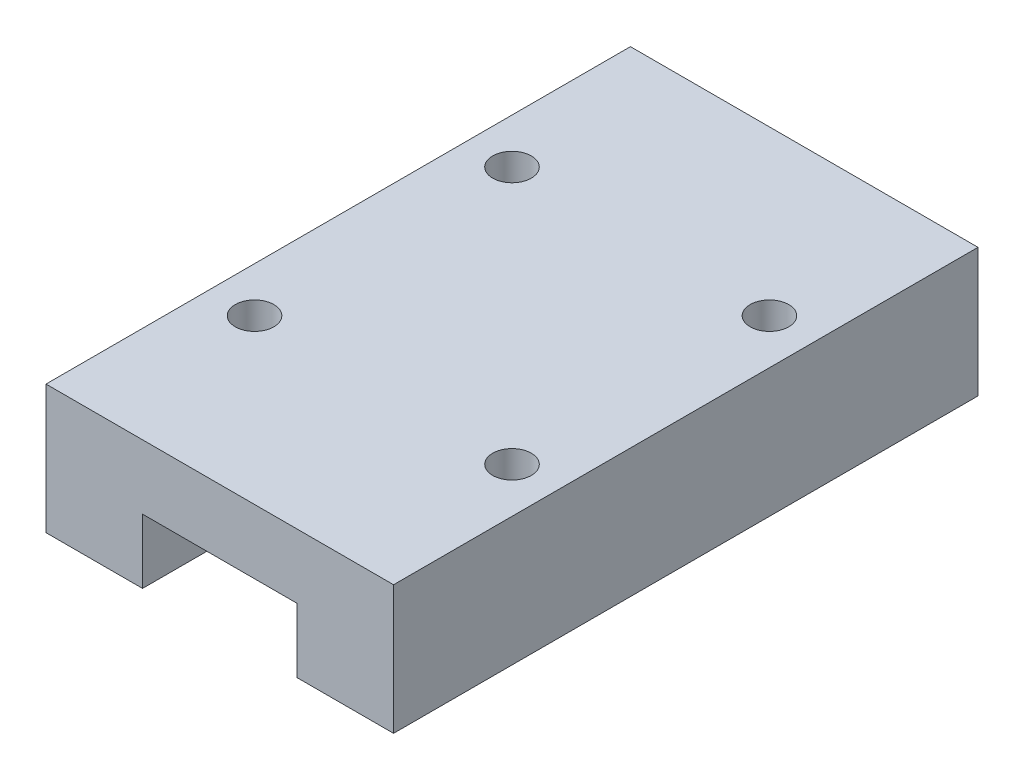
ISO-10303-21;
HEADER;
FILE_DESCRIPTION(('STEP AP214'),'2;1');
FILE_NAME('part.step','',(''),(''),'','','');
FILE_SCHEMA(('AUTOMOTIVE_DESIGN { 1 0 10303 214 1 1 1 1 }'));
ENDSEC;
DATA;
#1=APPLICATION_CONTEXT('core data for automotive mechanical design processes');
#2=APPLICATION_PROTOCOL_DEFINITION('international standard','automotive_design',2000,#1);
#3=PRODUCT_CONTEXT('',#1,'mechanical');
#4=PRODUCT('Part','Part','',(#3));
#5=PRODUCT_RELATED_PRODUCT_CATEGORY('part','',(#4));
#6=PRODUCT_DEFINITION_FORMATION('','',#4);
#7=PRODUCT_DEFINITION_CONTEXT('part definition',#1,'design');
#8=PRODUCT_DEFINITION('design','',#6,#7);
#9=PRODUCT_DEFINITION_SHAPE('','',#8);
#10=(LENGTH_UNIT() NAMED_UNIT(*) SI_UNIT(.MILLI.,.METRE.));
#11=(NAMED_UNIT(*) PLANE_ANGLE_UNIT() SI_UNIT($,.RADIAN.));
#12=(NAMED_UNIT(*) SI_UNIT($,.STERADIAN.) SOLID_ANGLE_UNIT());
#13=UNCERTAINTY_MEASURE_WITH_UNIT(LENGTH_MEASURE(1.E-05),#10,'distance_accuracy_value','');
#14=(GEOMETRIC_REPRESENTATION_CONTEXT(3) GLOBAL_UNCERTAINTY_ASSIGNED_CONTEXT((#13)) GLOBAL_UNIT_ASSIGNED_CONTEXT((#10,
#11,#12)) REPRESENTATION_CONTEXT('',''));
#15=CARTESIAN_POINT('',(0.,0.,0.));
#16=DIRECTION('',(0.,0.,1.));
#17=DIRECTION('',(1.,0.,0.));
#18=AXIS2_PLACEMENT_3D('',#15,#16,#17);
#19=CARTESIAN_POINT('',(0.,0.,45.4));
#20=DIRECTION('',(0.,1.,0.));
#21=DIRECTION('',(0.,0.,1.));
#22=AXIS2_PLACEMENT_3D('',#19,#20,#21);
#23=PLANE('',#22);
#24=DIRECTION('',(1.,0.,0.));
#25=VECTOR('',#24,1.);
#26=CARTESIAN_POINT('',(0.,0.,0.));
#27=LINE('',#26,#25);
#28=CARTESIAN_POINT('',(-6.,0.,0.));
#29=VERTEX_POINT('',#28);
#30=CARTESIAN_POINT('',(6.,0.,0.));
#31=VERTEX_POINT('',#30);
#32=EDGE_CURVE('E152',#29,#31,#27,.T.);
#33=ORIENTED_EDGE('',*,*,#32,.T.);
#34=DIRECTION('',(0.,0.,-1.));
#35=VECTOR('',#34,1.);
#36=CARTESIAN_POINT('',(6.,0.,45.4));
#37=LINE('',#36,#35);
#38=CARTESIAN_POINT('',(6.,0.,45.4));
#39=VERTEX_POINT('',#38);
#40=EDGE_CURVE('E11',#39,#31,#37,.T.);
#41=ORIENTED_EDGE('',*,*,#40,.F.);
#42=DIRECTION('',(1.,0.,0.));
#43=VECTOR('',#42,1.);
#44=CARTESIAN_POINT('',(0.,0.,45.4));
#45=LINE('',#44,#43);
#46=CARTESIAN_POINT('',(-6.,0.,45.4));
#47=VERTEX_POINT('',#46);
#48=EDGE_CURVE('E141',#47,#39,#45,.T.);
#49=ORIENTED_EDGE('',*,*,#48,.F.);
#50=DIRECTION('',(0.,0.,-1.));
#51=VECTOR('',#50,1.);
#52=CARTESIAN_POINT('',(-6.,0.,45.4));
#53=LINE('',#52,#51);
#54=EDGE_CURVE('E56',#47,#29,#53,.T.);
#55=ORIENTED_EDGE('',*,*,#54,.T.);
#56=EDGE_LOOP('',(#33,#41,#49,#55));
#57=FACE_BOUND('',#56,.T.);
#58=ADVANCED_FACE('F40',(#57),#23,.F.);
#59=CARTESIAN_POINT('',(6.,0.,45.4));
#60=DIRECTION('',(1.,0.,0.));
#61=DIRECTION('',(0.,1.,0.));
#62=AXIS2_PLACEMENT_3D('',#59,#60,#61);
#63=PLANE('',#62);
#64=DIRECTION('',(0.,-1.,0.));
#65=VECTOR('',#64,1.);
#66=CARTESIAN_POINT('',(6.,0.,0.));
#67=LINE('',#66,#65);
#68=CARTESIAN_POINT('',(6.,-5.,0.));
#69=VERTEX_POINT('',#68);
#70=EDGE_CURVE('E209',#31,#69,#67,.T.);
#71=ORIENTED_EDGE('',*,*,#70,.T.);
#72=DIRECTION('',(0.,0.,-1.));
#73=VECTOR('',#72,1.);
#74=CARTESIAN_POINT('',(6.,-5.,45.4));
#75=LINE('',#74,#73);
#76=CARTESIAN_POINT('',(6.,-5.,45.4));
#77=VERTEX_POINT('',#76);
#78=EDGE_CURVE('E48',#77,#69,#75,.T.);
#79=ORIENTED_EDGE('',*,*,#78,.F.);
#80=DIRECTION('',(0.,-1.,0.));
#81=VECTOR('',#80,1.);
#82=CARTESIAN_POINT('',(6.,0.,45.4));
#83=LINE('',#82,#81);
#84=EDGE_CURVE('E94',#39,#77,#83,.T.);
#85=ORIENTED_EDGE('',*,*,#84,.F.);
#86=ORIENTED_EDGE('',*,*,#40,.T.);
#87=EDGE_LOOP('',(#71,#79,#85,#86));
#88=FACE_BOUND('',#87,.T.);
#89=ADVANCED_FACE('F210',(#88),#63,.F.);
#90=CARTESIAN_POINT('',(0.,-5.,45.4));
#91=DIRECTION('',(0.,-1.,0.));
#92=DIRECTION('',(1.,0.,0.));
#93=AXIS2_PLACEMENT_3D('',#90,#91,#92);
#94=PLANE('',#93);
#95=DIRECTION('',(-1.,0.,0.));
#96=VECTOR('',#95,1.);
#97=CARTESIAN_POINT('',(0.,-5.,0.));
#98=LINE('',#97,#96);
#99=CARTESIAN_POINT('',(13.5,-5.,0.));
#100=VERTEX_POINT('',#99);
#101=EDGE_CURVE('E196',#100,#69,#98,.T.);
#102=ORIENTED_EDGE('',*,*,#101,.F.);
#103=DIRECTION('',(0.,0.,-1.));
#104=VECTOR('',#103,1.);
#105=CARTESIAN_POINT('',(13.5,-5.,45.4));
#106=LINE('',#105,#104);
#107=CARTESIAN_POINT('',(13.5,-5.,45.4));
#108=VERTEX_POINT('',#107);
#109=EDGE_CURVE('E204',#108,#100,#106,.T.);
#110=ORIENTED_EDGE('',*,*,#109,.F.);
#111=DIRECTION('',(-1.,0.,0.));
#112=VECTOR('',#111,1.);
#113=CARTESIAN_POINT('',(0.,-5.,45.4));
#114=LINE('',#113,#112);
#115=EDGE_CURVE('E133',#108,#77,#114,.T.);
#116=ORIENTED_EDGE('',*,*,#115,.T.);
#117=ORIENTED_EDGE('',*,*,#78,.T.);
#118=EDGE_LOOP('',(#102,#110,#116,#117));
#119=FACE_BOUND('',#118,.T.);
#120=ADVANCED_FACE('F207',(#119),#94,.T.);
#121=CARTESIAN_POINT('',(13.5,0.,45.4));
#122=DIRECTION('',(-1.,0.,0.));
#123=DIRECTION('',(0.,0.,1.));
#124=AXIS2_PLACEMENT_3D('',#121,#122,#123);
#125=PLANE('',#124);
#126=DIRECTION('',(0.,1.,0.));
#127=VECTOR('',#126,1.);
#128=CARTESIAN_POINT('',(13.5,0.,0.));
#129=LINE('',#128,#127);
#130=CARTESIAN_POINT('',(13.5,5.,0.));
#131=VERTEX_POINT('',#130);
#132=EDGE_CURVE('E189',#100,#131,#129,.T.);
#133=ORIENTED_EDGE('',*,*,#132,.T.);
#134=DIRECTION('',(0.,0.,-1.));
#135=VECTOR('',#134,1.);
#136=CARTESIAN_POINT('',(13.5,5.,45.4));
#137=LINE('',#136,#135);
#138=CARTESIAN_POINT('',(13.5,5.,45.4));
#139=VERTEX_POINT('',#138);
#140=EDGE_CURVE('E186',#139,#131,#137,.T.);
#141=ORIENTED_EDGE('',*,*,#140,.F.);
#142=DIRECTION('',(0.,1.,0.));
#143=VECTOR('',#142,1.);
#144=CARTESIAN_POINT('',(13.5,0.,45.4));
#145=LINE('',#144,#143);
#146=EDGE_CURVE('E138',#108,#139,#145,.T.);
#147=ORIENTED_EDGE('',*,*,#146,.F.);
#148=ORIENTED_EDGE('',*,*,#109,.T.);
#149=EDGE_LOOP('',(#133,#141,#147,#148));
#150=FACE_BOUND('',#149,.T.);
#151=ADVANCED_FACE('F176',(#150),#125,.F.);
#152=CARTESIAN_POINT('',(0.,5.,45.4));
#153=DIRECTION('',(0.,-1.,0.));
#154=DIRECTION('',(1.,0.,0.));
#155=AXIS2_PLACEMENT_3D('',#152,#153,#154);
#156=PLANE('',#155);
#157=CARTESIAN_POINT('',(-9.99999999999999,5.,32.7));
#158=DIRECTION('',(0.,1.,0.));
#159=DIRECTION('',(-1.,0.,0.));
#160=AXIS2_PLACEMENT_3D('',#157,#158,#159);
#161=CIRCLE('',#160,1.5);
#162=CARTESIAN_POINT('',(-11.5,5.,32.7));
#163=VERTEX_POINT('',#162);
#164=EDGE_CURVE('E156',#163,#163,#161,.T.);
#165=ORIENTED_EDGE('',*,*,#164,.F.);
#166=EDGE_LOOP('',(#165));
#167=FACE_BOUND('',#166,.T.);
#168=CARTESIAN_POINT('',(10.,5.,12.7));
#169=DIRECTION('',(0.,1.,0.));
#170=DIRECTION('',(-1.,0.,0.));
#171=AXIS2_PLACEMENT_3D('',#168,#169,#170);
#172=CIRCLE('',#171,1.5);
#173=CARTESIAN_POINT('',(8.5,5.,12.7));
#174=VERTEX_POINT('',#173);
#175=EDGE_CURVE('E162',#174,#174,#172,.T.);
#176=ORIENTED_EDGE('',*,*,#175,.F.);
#177=EDGE_LOOP('',(#176));
#178=FACE_BOUND('',#177,.T.);
#179=CARTESIAN_POINT('',(10.,5.,32.7));
#180=DIRECTION('',(0.,1.,0.));
#181=DIRECTION('',(-1.,0.,0.));
#182=AXIS2_PLACEMENT_3D('',#179,#180,#181);
#183=CIRCLE('',#182,1.5);
#184=CARTESIAN_POINT('',(8.5,5.,32.7));
#185=VERTEX_POINT('',#184);
#186=EDGE_CURVE('E149',#185,#185,#183,.T.);
#187=ORIENTED_EDGE('',*,*,#186,.F.);
#188=EDGE_LOOP('',(#187));
#189=FACE_BOUND('',#188,.T.);
#190=CARTESIAN_POINT('',(-9.99999999999999,5.,12.7));
#191=DIRECTION('',(0.,1.,0.));
#192=DIRECTION('',(-1.,0.,0.));
#193=AXIS2_PLACEMENT_3D('',#190,#191,#192);
#194=CIRCLE('',#193,1.5);
#195=CARTESIAN_POINT('',(-11.5,5.,12.7));
#196=VERTEX_POINT('',#195);
#197=EDGE_CURVE('E145',#196,#196,#194,.T.);
#198=ORIENTED_EDGE('',*,*,#197,.F.);
#199=EDGE_LOOP('',(#198));
#200=FACE_BOUND('',#199,.T.);
#201=DIRECTION('',(-1.,0.,0.));
#202=VECTOR('',#201,1.);
#203=CARTESIAN_POINT('',(0.,5.,0.));
#204=LINE('',#203,#202);
#205=CARTESIAN_POINT('',(-13.5,5.,0.));
#206=VERTEX_POINT('',#205);
#207=EDGE_CURVE('E184',#131,#206,#204,.T.);
#208=ORIENTED_EDGE('',*,*,#207,.T.);
#209=DIRECTION('',(0.,0.,-1.));
#210=VECTOR('',#209,1.);
#211=CARTESIAN_POINT('',(-13.5,5.,45.4));
#212=LINE('',#211,#210);
#213=CARTESIAN_POINT('',(-13.5,5.,45.4));
#214=VERTEX_POINT('',#213);
#215=EDGE_CURVE('E119',#214,#206,#212,.T.);
#216=ORIENTED_EDGE('',*,*,#215,.F.);
#217=DIRECTION('',(-1.,0.,0.));
#218=VECTOR('',#217,1.);
#219=CARTESIAN_POINT('',(0.,5.,45.4));
#220=LINE('',#219,#218);
#221=EDGE_CURVE('E127',#139,#214,#220,.T.);
#222=ORIENTED_EDGE('',*,*,#221,.F.);
#223=ORIENTED_EDGE('',*,*,#140,.T.);
#224=EDGE_LOOP('',(#208,#216,#222,#223));
#225=FACE_BOUND('',#224,.T.);
#226=ADVANCED_FACE('F173',(#167,#178,#189,#200,#225),#156,.F.);
#227=CARTESIAN_POINT('',(-13.5,0.,45.4));
#228=DIRECTION('',(-1.,0.,0.));
#229=DIRECTION('',(0.,0.,1.));
#230=AXIS2_PLACEMENT_3D('',#227,#228,#229);
#231=PLANE('',#230);
#232=DIRECTION('',(0.,1.,0.));
#233=VECTOR('',#232,1.);
#234=CARTESIAN_POINT('',(-13.5,0.,0.));
#235=LINE('',#234,#233);
#236=CARTESIAN_POINT('',(-13.5,-5.,0.));
#237=VERTEX_POINT('',#236);
#238=EDGE_CURVE('E115',#237,#206,#235,.T.);
#239=ORIENTED_EDGE('',*,*,#238,.F.);
#240=DIRECTION('',(0.,0.,-1.));
#241=VECTOR('',#240,1.);
#242=CARTESIAN_POINT('',(-13.5,-5.,45.4));
#243=LINE('',#242,#241);
#244=CARTESIAN_POINT('',(-13.5,-5.,45.4));
#245=VERTEX_POINT('',#244);
#246=EDGE_CURVE('E110',#245,#237,#243,.T.);
#247=ORIENTED_EDGE('',*,*,#246,.F.);
#248=DIRECTION('',(0.,1.,0.));
#249=VECTOR('',#248,1.);
#250=CARTESIAN_POINT('',(-13.5,0.,45.4));
#251=LINE('',#250,#249);
#252=EDGE_CURVE('E113',#245,#214,#251,.T.);
#253=ORIENTED_EDGE('',*,*,#252,.T.);
#254=ORIENTED_EDGE('',*,*,#215,.T.);
#255=EDGE_LOOP('',(#239,#247,#253,#254));
#256=FACE_BOUND('',#255,.T.);
#257=ADVANCED_FACE('F112',(#256),#231,.T.);
#258=CARTESIAN_POINT('',(-6.,-5.,0.));
#259=VERTEX_POINT('',#258);
#260=EDGE_CURVE('E193',#259,#237,#98,.T.);
#261=ORIENTED_EDGE('',*,*,#260,.F.);
#262=DIRECTION('',(0.,0.,-1.));
#263=VECTOR('',#262,1.);
#264=CARTESIAN_POINT('',(-6.,-5.,45.4));
#265=LINE('',#264,#263);
#266=CARTESIAN_POINT('',(-6.,-5.,45.4));
#267=VERTEX_POINT('',#266);
#268=EDGE_CURVE('E82',#267,#259,#265,.T.);
#269=ORIENTED_EDGE('',*,*,#268,.F.);
#270=EDGE_CURVE('E125',#267,#245,#114,.T.);
#271=ORIENTED_EDGE('',*,*,#270,.T.);
#272=ORIENTED_EDGE('',*,*,#246,.T.);
#273=EDGE_LOOP('',(#261,#269,#271,#272));
#274=FACE_BOUND('',#273,.T.);
#275=ADVANCED_FACE('F130',(#274),#94,.T.);
#276=CARTESIAN_POINT('',(-6.,0.,45.4));
#277=DIRECTION('',(1.,0.,0.));
#278=DIRECTION('',(0.,1.,0.));
#279=AXIS2_PLACEMENT_3D('',#276,#277,#278);
#280=PLANE('',#279);
#281=DIRECTION('',(0.,-1.,0.));
#282=VECTOR('',#281,1.);
#283=CARTESIAN_POINT('',(-6.,0.,0.));
#284=LINE('',#283,#282);
#285=EDGE_CURVE('E142',#29,#259,#284,.T.);
#286=ORIENTED_EDGE('',*,*,#285,.F.);
#287=ORIENTED_EDGE('',*,*,#54,.F.);
#288=DIRECTION('',(0.,-1.,0.));
#289=VECTOR('',#288,1.);
#290=CARTESIAN_POINT('',(-6.,0.,45.4));
#291=LINE('',#290,#289);
#292=EDGE_CURVE('E131',#47,#267,#291,.T.);
#293=ORIENTED_EDGE('',*,*,#292,.T.);
#294=ORIENTED_EDGE('',*,*,#268,.T.);
#295=EDGE_LOOP('',(#286,#287,#293,#294));
#296=FACE_BOUND('',#295,.T.);
#297=ADVANCED_FACE('F215',(#296),#280,.T.);
#298=CARTESIAN_POINT('',(0.,0.,45.4));
#299=DIRECTION('',(0.,0.,1.));
#300=DIRECTION('',(1.,0.,0.));
#301=AXIS2_PLACEMENT_3D('',#298,#299,#300);
#302=PLANE('',#301);
#303=ORIENTED_EDGE('',*,*,#48,.T.);
#304=ORIENTED_EDGE('',*,*,#84,.T.);
#305=ORIENTED_EDGE('',*,*,#115,.F.);
#306=ORIENTED_EDGE('',*,*,#146,.T.);
#307=ORIENTED_EDGE('',*,*,#221,.T.);
#308=ORIENTED_EDGE('',*,*,#252,.F.);
#309=ORIENTED_EDGE('',*,*,#270,.F.);
#310=ORIENTED_EDGE('',*,*,#292,.F.);
#311=EDGE_LOOP('',(#303,#304,#305,#306,#307,#308,#309,#310));
#312=FACE_BOUND('',#311,.T.);
#313=ADVANCED_FACE('F123',(#312),#302,.T.);
#314=CARTESIAN_POINT('',(0.,0.,0.));
#315=DIRECTION('',(0.,0.,1.));
#316=DIRECTION('',(1.,0.,0.));
#317=AXIS2_PLACEMENT_3D('',#314,#315,#316);
#318=PLANE('',#317);
#319=ORIENTED_EDGE('',*,*,#32,.F.);
#320=ORIENTED_EDGE('',*,*,#285,.T.);
#321=ORIENTED_EDGE('',*,*,#260,.T.);
#322=ORIENTED_EDGE('',*,*,#238,.T.);
#323=ORIENTED_EDGE('',*,*,#207,.F.);
#324=ORIENTED_EDGE('',*,*,#132,.F.);
#325=ORIENTED_EDGE('',*,*,#101,.T.);
#326=ORIENTED_EDGE('',*,*,#70,.F.);
#327=EDGE_LOOP('',(#319,#320,#321,#322,#323,#324,#325,#326));
#328=FACE_BOUND('',#327,.T.);
#329=ADVANCED_FACE('F191',(#328),#318,.F.);
#330=CARTESIAN_POINT('',(-9.99999999999999,1.5,12.7));
#331=DIRECTION('',(0.,1.,0.));
#332=DIRECTION('',(-1.,0.,0.));
#333=AXIS2_PLACEMENT_3D('',#330,#331,#332);
#334=CYLINDRICAL_SURFACE('',#333,1.5);
#335=CARTESIAN_POINT('',(-9.99999999999999,1.5,12.7));
#336=DIRECTION('',(0.,1.,0.));
#337=DIRECTION('',(-1.,0.,0.));
#338=AXIS2_PLACEMENT_3D('',#335,#336,#337);
#339=CIRCLE('',#338,1.5);
#340=CARTESIAN_POINT('',(-11.5,1.5,12.7));
#341=VERTEX_POINT('',#340);
#342=EDGE_CURVE('E148',#341,#341,#339,.T.);
#343=ORIENTED_EDGE('',*,*,#342,.F.);
#344=EDGE_LOOP('',(#343));
#345=FACE_BOUND('',#344,.T.);
#346=ORIENTED_EDGE('',*,*,#197,.T.);
#347=EDGE_LOOP('',(#346));
#348=FACE_BOUND('',#347,.T.);
#349=ADVANCED_FACE('F267',(#345,#348),#334,.F.);
#350=CARTESIAN_POINT('',(-9.99999999999999,1.5,12.7));
#351=DIRECTION('',(0.,1.,0.));
#352=DIRECTION('',(-1.,0.,0.));
#353=AXIS2_PLACEMENT_3D('',#350,#351,#352);
#354=PLANE('',#353);
#355=ORIENTED_EDGE('',*,*,#342,.T.);
#356=EDGE_LOOP('',(#355));
#357=FACE_BOUND('',#356,.T.);
#358=ADVANCED_FACE('F275',(#357),#354,.T.);
#359=CARTESIAN_POINT('',(10.,1.5,32.7));
#360=DIRECTION('',(0.,1.,0.));
#361=DIRECTION('',(-1.,0.,0.));
#362=AXIS2_PLACEMENT_3D('',#359,#360,#361);
#363=CYLINDRICAL_SURFACE('',#362,1.5);
#364=CARTESIAN_POINT('',(10.,1.5,32.7));
#365=DIRECTION('',(0.,1.,0.));
#366=DIRECTION('',(-1.,0.,0.));
#367=AXIS2_PLACEMENT_3D('',#364,#365,#366);
#368=CIRCLE('',#367,1.5);
#369=CARTESIAN_POINT('',(8.5,1.5,32.7));
#370=VERTEX_POINT('',#369);
#371=EDGE_CURVE('E165',#370,#370,#368,.T.);
#372=ORIENTED_EDGE('',*,*,#371,.F.);
#373=EDGE_LOOP('',(#372));
#374=FACE_BOUND('',#373,.T.);
#375=ORIENTED_EDGE('',*,*,#186,.T.);
#376=EDGE_LOOP('',(#375));
#377=FACE_BOUND('',#376,.T.);
#378=ADVANCED_FACE('F171',(#374,#377),#363,.F.);
#379=CARTESIAN_POINT('',(10.,1.5,32.7));
#380=DIRECTION('',(0.,1.,0.));
#381=DIRECTION('',(-1.,0.,0.));
#382=AXIS2_PLACEMENT_3D('',#379,#380,#381);
#383=PLANE('',#382);
#384=ORIENTED_EDGE('',*,*,#371,.T.);
#385=EDGE_LOOP('',(#384));
#386=FACE_BOUND('',#385,.T.);
#387=ADVANCED_FACE('F294',(#386),#383,.T.);
#388=CARTESIAN_POINT('',(10.,1.5,12.7));
#389=DIRECTION('',(0.,1.,0.));
#390=DIRECTION('',(-1.,0.,0.));
#391=AXIS2_PLACEMENT_3D('',#388,#389,#390);
#392=CYLINDRICAL_SURFACE('',#391,1.5);
#393=CARTESIAN_POINT('',(10.,1.5,12.7));
#394=DIRECTION('',(0.,1.,0.));
#395=DIRECTION('',(-1.,0.,0.));
#396=AXIS2_PLACEMENT_3D('',#393,#394,#395);
#397=CIRCLE('',#396,1.5);
#398=CARTESIAN_POINT('',(8.5,1.5,12.7));
#399=VERTEX_POINT('',#398);
#400=EDGE_CURVE('E159',#399,#399,#397,.T.);
#401=ORIENTED_EDGE('',*,*,#400,.F.);
#402=EDGE_LOOP('',(#401));
#403=FACE_BOUND('',#402,.T.);
#404=ORIENTED_EDGE('',*,*,#175,.T.);
#405=EDGE_LOOP('',(#404));
#406=FACE_BOUND('',#405,.T.);
#407=ADVANCED_FACE('F304',(#403,#406),#392,.F.);
#408=CARTESIAN_POINT('',(10.,1.5,12.7));
#409=DIRECTION('',(0.,1.,0.));
#410=DIRECTION('',(-1.,0.,0.));
#411=AXIS2_PLACEMENT_3D('',#408,#409,#410);
#412=PLANE('',#411);
#413=ORIENTED_EDGE('',*,*,#400,.T.);
#414=EDGE_LOOP('',(#413));
#415=FACE_BOUND('',#414,.T.);
#416=ADVANCED_FACE('F314',(#415),#412,.T.);
#417=CARTESIAN_POINT('',(-9.99999999999999,1.5,32.7));
#418=DIRECTION('',(0.,1.,0.));
#419=DIRECTION('',(-1.,0.,0.));
#420=AXIS2_PLACEMENT_3D('',#417,#418,#419);
#421=CYLINDRICAL_SURFACE('',#420,1.5);
#422=CARTESIAN_POINT('',(-9.99999999999999,1.5,32.7));
#423=DIRECTION('',(0.,1.,0.));
#424=DIRECTION('',(-1.,0.,0.));
#425=AXIS2_PLACEMENT_3D('',#422,#423,#424);
#426=CIRCLE('',#425,1.5);
#427=CARTESIAN_POINT('',(-11.5,1.5,32.7));
#428=VERTEX_POINT('',#427);
#429=EDGE_CURVE('E153',#428,#428,#426,.T.);
#430=ORIENTED_EDGE('',*,*,#429,.F.);
#431=EDGE_LOOP('',(#430));
#432=FACE_BOUND('',#431,.T.);
#433=ORIENTED_EDGE('',*,*,#164,.T.);
#434=EDGE_LOOP('',(#433));
#435=FACE_BOUND('',#434,.T.);
#436=ADVANCED_FACE('F324',(#432,#435),#421,.F.);
#437=CARTESIAN_POINT('',(-9.99999999999999,1.5,32.7));
#438=DIRECTION('',(0.,1.,0.));
#439=DIRECTION('',(-1.,0.,0.));
#440=AXIS2_PLACEMENT_3D('',#437,#438,#439);
#441=PLANE('',#440);
#442=ORIENTED_EDGE('',*,*,#429,.T.);
#443=EDGE_LOOP('',(#442));
#444=FACE_BOUND('',#443,.T.);
#445=ADVANCED_FACE('F334',(#444),#441,.T.);
#446=CLOSED_SHELL('',(#58,#89,#120,#151,#226,#257,#275,#297,#313,#329,#349,#358,#378,#387,#407,
#416,#436,#445));
#447=MANIFOLD_SOLID_BREP('B2',#446);
#448=ADVANCED_BREP_SHAPE_REPRESENTATION('',(#18,#447),#14);
#449=SHAPE_DEFINITION_REPRESENTATION(#9,#448);
ENDSEC;
END-ISO-10303-21;
